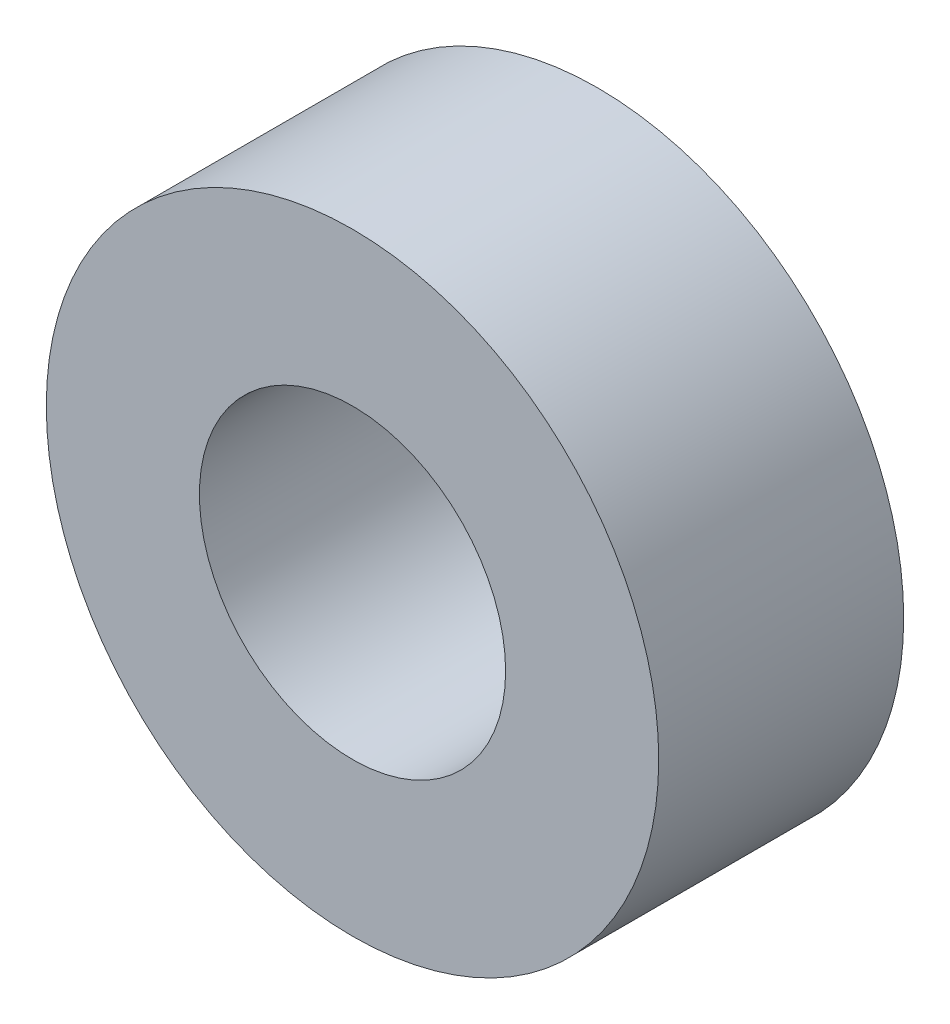
ISO-10303-21;
HEADER;
FILE_DESCRIPTION(('STEP AP214'),'2;1');
FILE_NAME('part.step','',(''),(''),'','','');
FILE_SCHEMA(('AUTOMOTIVE_DESIGN { 1 0 10303 214 1 1 1 1 }'));
ENDSEC;
DATA;
#1=APPLICATION_CONTEXT('core data for automotive mechanical design processes');
#2=APPLICATION_PROTOCOL_DEFINITION('international standard','automotive_design',2000,#1);
#3=PRODUCT_CONTEXT('',#1,'mechanical');
#4=PRODUCT('Part','Part','',(#3));
#5=PRODUCT_RELATED_PRODUCT_CATEGORY('part','',(#4));
#6=PRODUCT_DEFINITION_FORMATION('','',#4);
#7=PRODUCT_DEFINITION_CONTEXT('part definition',#1,'design');
#8=PRODUCT_DEFINITION('design','',#6,#7);
#9=PRODUCT_DEFINITION_SHAPE('','',#8);
#10=(LENGTH_UNIT() NAMED_UNIT(*) SI_UNIT(.MILLI.,.METRE.));
#11=(NAMED_UNIT(*) PLANE_ANGLE_UNIT() SI_UNIT($,.RADIAN.));
#12=(NAMED_UNIT(*) SI_UNIT($,.STERADIAN.) SOLID_ANGLE_UNIT());
#13=UNCERTAINTY_MEASURE_WITH_UNIT(LENGTH_MEASURE(1.E-05),#10,'distance_accuracy_value','');
#14=(GEOMETRIC_REPRESENTATION_CONTEXT(3) GLOBAL_UNCERTAINTY_ASSIGNED_CONTEXT((#13)) GLOBAL_UNIT_ASSIGNED_CONTEXT((#10,
#11,#12)) REPRESENTATION_CONTEXT('',''));
#15=CARTESIAN_POINT('',(0.,0.,0.));
#16=DIRECTION('',(0.,0.,1.));
#17=DIRECTION('',(1.,0.,0.));
#18=AXIS2_PLACEMENT_3D('',#15,#16,#17);
#19=CARTESIAN_POINT('',(0.,0.,1.));
#20=DIRECTION('',(0.,0.,1.));
#21=DIRECTION('',(1.,0.,0.));
#22=AXIS2_PLACEMENT_3D('',#19,#20,#21);
#23=PLANE('',#22);
#24=CARTESIAN_POINT('',(0.,0.,1.));
#25=DIRECTION('',(0.,0.,1.));
#26=DIRECTION('',(1.,0.,0.));
#27=AXIS2_PLACEMENT_3D('',#24,#25,#26);
#28=CIRCLE('',#27,1.25);
#29=CARTESIAN_POINT('',(1.25,0.,1.));
#30=VERTEX_POINT('',#29);
#31=EDGE_CURVE('E10',#30,#30,#28,.T.);
#32=ORIENTED_EDGE('',*,*,#31,.T.);
#33=EDGE_LOOP('',(#32));
#34=FACE_BOUND('',#33,.T.);
#35=CARTESIAN_POINT('',(0.,0.,1.));
#36=DIRECTION('',(0.,0.,1.));
#37=DIRECTION('',(1.,0.,0.));
#38=AXIS2_PLACEMENT_3D('',#35,#36,#37);
#39=CIRCLE('',#38,0.625);
#40=CARTESIAN_POINT('',(0.625,0.,1.));
#41=VERTEX_POINT('',#40);
#42=EDGE_CURVE('E45',#41,#41,#39,.T.);
#43=ORIENTED_EDGE('',*,*,#42,.F.);
#44=EDGE_LOOP('',(#43));
#45=FACE_BOUND('',#44,.T.);
#46=ADVANCED_FACE('F34',(#34,#45),#23,.T.);
#47=CARTESIAN_POINT('',(0.,0.,0.));
#48=DIRECTION('',(0.,0.,1.));
#49=DIRECTION('',(1.,0.,0.));
#50=AXIS2_PLACEMENT_3D('',#47,#48,#49);
#51=PLANE('',#50);
#52=CARTESIAN_POINT('',(0.,0.,0.));
#53=DIRECTION('',(0.,0.,1.));
#54=DIRECTION('',(1.,0.,0.));
#55=AXIS2_PLACEMENT_3D('',#52,#53,#54);
#56=CIRCLE('',#55,1.25);
#57=CARTESIAN_POINT('',(1.25,0.,0.));
#58=VERTEX_POINT('',#57);
#59=EDGE_CURVE('E38',#58,#58,#56,.T.);
#60=ORIENTED_EDGE('',*,*,#59,.F.);
#61=EDGE_LOOP('',(#60));
#62=FACE_BOUND('',#61,.T.);
#63=CARTESIAN_POINT('',(0.,0.,0.));
#64=DIRECTION('',(0.,0.,1.));
#65=DIRECTION('',(1.,0.,0.));
#66=AXIS2_PLACEMENT_3D('',#63,#64,#65);
#67=CIRCLE('',#66,0.625);
#68=CARTESIAN_POINT('',(0.625,0.,0.));
#69=VERTEX_POINT('',#68);
#70=EDGE_CURVE('E47',#69,#69,#67,.T.);
#71=ORIENTED_EDGE('',*,*,#70,.T.);
#72=EDGE_LOOP('',(#71));
#73=FACE_BOUND('',#72,.T.);
#74=ADVANCED_FACE('F57',(#62,#73),#51,.F.);
#75=CARTESIAN_POINT('',(0.,0.,1.));
#76=DIRECTION('',(0.,0.,-1.));
#77=DIRECTION('',(-1.,0.,0.));
#78=AXIS2_PLACEMENT_3D('',#75,#76,#77);
#79=CYLINDRICAL_SURFACE('',#78,1.25);
#80=ORIENTED_EDGE('',*,*,#31,.F.);
#81=EDGE_LOOP('',(#80));
#82=FACE_BOUND('',#81,.T.);
#83=ORIENTED_EDGE('',*,*,#59,.T.);
#84=EDGE_LOOP('',(#83));
#85=FACE_BOUND('',#84,.T.);
#86=ADVANCED_FACE('F36',(#82,#85),#79,.T.);
#87=CARTESIAN_POINT('',(0.,0.,1.));
#88=DIRECTION('',(0.,0.,-1.));
#89=DIRECTION('',(-1.,0.,0.));
#90=AXIS2_PLACEMENT_3D('',#87,#88,#89);
#91=CYLINDRICAL_SURFACE('',#90,0.625);
#92=ORIENTED_EDGE('',*,*,#42,.T.);
#93=EDGE_LOOP('',(#92));
#94=FACE_BOUND('',#93,.T.);
#95=ORIENTED_EDGE('',*,*,#70,.F.);
#96=EDGE_LOOP('',(#95));
#97=FACE_BOUND('',#96,.T.);
#98=ADVANCED_FACE('F53',(#94,#97),#91,.F.);
#99=CLOSED_SHELL('',(#46,#74,#86,#98));
#100=MANIFOLD_SOLID_BREP('B2',#99);
#101=ADVANCED_BREP_SHAPE_REPRESENTATION('',(#18,#100),#14);
#102=SHAPE_DEFINITION_REPRESENTATION(#9,#101);
ENDSEC;
END-ISO-10303-21;
